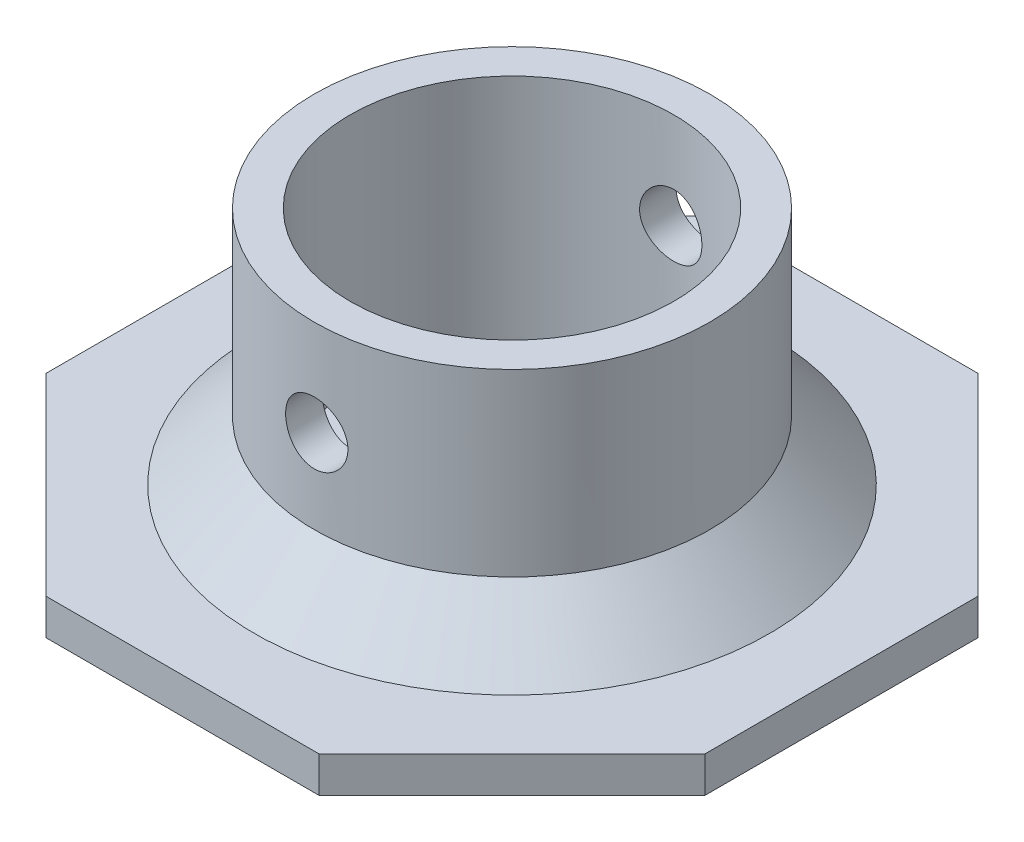
ISO-10303-21;
HEADER;
FILE_DESCRIPTION(('STEP AP214'),'2;1');
FILE_NAME('part.step','',(''),(''),'','','');
FILE_SCHEMA(('AUTOMOTIVE_DESIGN { 1 0 10303 214 1 1 1 1 }'));
ENDSEC;
DATA;
#1=APPLICATION_CONTEXT('core data for automotive mechanical design processes');
#2=APPLICATION_PROTOCOL_DEFINITION('international standard','automotive_design',2000,#1);
#3=PRODUCT_CONTEXT('',#1,'mechanical');
#4=PRODUCT('Part','Part','',(#3));
#5=PRODUCT_RELATED_PRODUCT_CATEGORY('part','',(#4));
#6=PRODUCT_DEFINITION_FORMATION('','',#4);
#7=PRODUCT_DEFINITION_CONTEXT('part definition',#1,'design');
#8=PRODUCT_DEFINITION('design','',#6,#7);
#9=PRODUCT_DEFINITION_SHAPE('','',#8);
#10=(LENGTH_UNIT() NAMED_UNIT(*) SI_UNIT(.MILLI.,.METRE.));
#11=(NAMED_UNIT(*) PLANE_ANGLE_UNIT() SI_UNIT($,.RADIAN.));
#12=(NAMED_UNIT(*) SI_UNIT($,.STERADIAN.) SOLID_ANGLE_UNIT());
#13=UNCERTAINTY_MEASURE_WITH_UNIT(LENGTH_MEASURE(1.E-05),#10,'distance_accuracy_value','');
#14=(GEOMETRIC_REPRESENTATION_CONTEXT(3) GLOBAL_UNCERTAINTY_ASSIGNED_CONTEXT((#13)) GLOBAL_UNIT_ASSIGNED_CONTEXT((#10,
#11,#12)) REPRESENTATION_CONTEXT('',''));
#15=CARTESIAN_POINT('',(0.,0.,0.));
#16=DIRECTION('',(0.,0.,1.));
#17=DIRECTION('',(1.,0.,0.));
#18=AXIS2_PLACEMENT_3D('',#15,#16,#17);
#19=CARTESIAN_POINT('',(11.3908729652601,3.,-27.5));
#20=DIRECTION('',(0.,0.,1.));
#21=DIRECTION('',(1.,0.,0.));
#22=AXIS2_PLACEMENT_3D('',#19,#20,#21);
#23=PLANE('',#22);
#24=DIRECTION('',(-1.,0.,0.));
#25=VECTOR('',#24,1.);
#26=CARTESIAN_POINT('',(11.3908729652601,0.,-27.5));
#27=LINE('',#26,#25);
#28=CARTESIAN_POINT('',(11.3908729652601,0.,-27.5));
#29=VERTEX_POINT('',#28);
#30=CARTESIAN_POINT('',(-11.3908729652601,0.,-27.5));
#31=VERTEX_POINT('',#30);
#32=EDGE_CURVE('E157',#29,#31,#27,.T.);
#33=ORIENTED_EDGE('',*,*,#32,.T.);
#34=DIRECTION('',(0.,-1.,0.));
#35=VECTOR('',#34,1.);
#36=CARTESIAN_POINT('',(-11.3908729652601,3.,-27.5));
#37=LINE('',#36,#35);
#38=CARTESIAN_POINT('',(-11.3908729652601,3.,-27.5));
#39=VERTEX_POINT('',#38);
#40=EDGE_CURVE('E199',#39,#31,#37,.T.);
#41=ORIENTED_EDGE('',*,*,#40,.F.);
#42=DIRECTION('',(-1.,0.,0.));
#43=VECTOR('',#42,1.);
#44=CARTESIAN_POINT('',(11.3908729652601,3.,-27.5));
#45=LINE('',#44,#43);
#46=CARTESIAN_POINT('',(11.3908729652601,3.,-27.5));
#47=VERTEX_POINT('',#46);
#48=EDGE_CURVE('E180',#47,#39,#45,.T.);
#49=ORIENTED_EDGE('',*,*,#48,.F.);
#50=DIRECTION('',(0.,-1.,0.));
#51=VECTOR('',#50,1.);
#52=CARTESIAN_POINT('',(11.3908729652601,3.,-27.5));
#53=LINE('',#52,#51);
#54=EDGE_CURVE('E153',#47,#29,#53,.T.);
#55=ORIENTED_EDGE('',*,*,#54,.T.);
#56=EDGE_LOOP('',(#33,#41,#49,#55));
#57=FACE_BOUND('',#56,.T.);
#58=ADVANCED_FACE('F53',(#57),#23,.F.);
#59=CARTESIAN_POINT('',(-11.3908729652601,3.,-27.5));
#60=DIRECTION('',(0.707106781186548,0.,0.707106781186547));
#61=DIRECTION('',(0.707106781186547,0.,-0.707106781186548));
#62=AXIS2_PLACEMENT_3D('',#59,#60,#61);
#63=PLANE('',#62);
#64=DIRECTION('',(-0.707106781186547,0.,0.707106781186548));
#65=VECTOR('',#64,1.);
#66=CARTESIAN_POINT('',(-11.3908729652601,0.,-27.5));
#67=LINE('',#66,#65);
#68=CARTESIAN_POINT('',(-27.5,0.,-11.3908729652601));
#69=VERTEX_POINT('',#68);
#70=EDGE_CURVE('E161',#31,#69,#67,.T.);
#71=ORIENTED_EDGE('',*,*,#70,.T.);
#72=DIRECTION('',(0.,-1.,0.));
#73=VECTOR('',#72,1.);
#74=CARTESIAN_POINT('',(-27.5,3.,-11.3908729652601));
#75=LINE('',#74,#73);
#76=CARTESIAN_POINT('',(-27.5,3.,-11.3908729652601));
#77=VERTEX_POINT('',#76);
#78=EDGE_CURVE('E195',#77,#69,#75,.T.);
#79=ORIENTED_EDGE('',*,*,#78,.F.);
#80=DIRECTION('',(-0.707106781186547,0.,0.707106781186548));
#81=VECTOR('',#80,1.);
#82=CARTESIAN_POINT('',(-11.3908729652601,3.,-27.5));
#83=LINE('',#82,#81);
#84=EDGE_CURVE('E116',#39,#77,#83,.T.);
#85=ORIENTED_EDGE('',*,*,#84,.F.);
#86=ORIENTED_EDGE('',*,*,#40,.T.);
#87=EDGE_LOOP('',(#71,#79,#85,#86));
#88=FACE_BOUND('',#87,.T.);
#89=ADVANCED_FACE('F277',(#88),#63,.F.);
#90=CARTESIAN_POINT('',(-27.5,3.,-11.3908729652601));
#91=DIRECTION('',(1.,0.,0.));
#92=DIRECTION('',(0.,0.,-1.));
#93=AXIS2_PLACEMENT_3D('',#90,#91,#92);
#94=PLANE('',#93);
#95=DIRECTION('',(0.,0.,1.));
#96=VECTOR('',#95,1.);
#97=CARTESIAN_POINT('',(-27.5,0.,-11.3908729652601));
#98=LINE('',#97,#96);
#99=CARTESIAN_POINT('',(-27.5,0.,11.3908729652601));
#100=VERTEX_POINT('',#99);
#101=EDGE_CURVE('E165',#69,#100,#98,.T.);
#102=ORIENTED_EDGE('',*,*,#101,.T.);
#103=DIRECTION('',(0.,-1.,0.));
#104=VECTOR('',#103,1.);
#105=CARTESIAN_POINT('',(-27.5,3.,11.3908729652601));
#106=LINE('',#105,#104);
#107=CARTESIAN_POINT('',(-27.5,3.,11.3908729652601));
#108=VERTEX_POINT('',#107);
#109=EDGE_CURVE('E191',#108,#100,#106,.T.);
#110=ORIENTED_EDGE('',*,*,#109,.F.);
#111=DIRECTION('',(0.,0.,1.));
#112=VECTOR('',#111,1.);
#113=CARTESIAN_POINT('',(-27.5,3.,-11.3908729652601));
#114=LINE('',#113,#112);
#115=EDGE_CURVE('E291',#77,#108,#114,.T.);
#116=ORIENTED_EDGE('',*,*,#115,.F.);
#117=ORIENTED_EDGE('',*,*,#78,.T.);
#118=EDGE_LOOP('',(#102,#110,#116,#117));
#119=FACE_BOUND('',#118,.T.);
#120=ADVANCED_FACE('F273',(#119),#94,.F.);
#121=CARTESIAN_POINT('',(-27.5,3.,11.3908729652601));
#122=DIRECTION('',(0.707106781186547,0.,-0.707106781186548));
#123=DIRECTION('',(-0.707106781186548,0.,-0.707106781186547));
#124=AXIS2_PLACEMENT_3D('',#121,#122,#123);
#125=PLANE('',#124);
#126=DIRECTION('',(0.707106781186548,0.,0.707106781186547));
#127=VECTOR('',#126,1.);
#128=CARTESIAN_POINT('',(-27.5,0.,11.3908729652601));
#129=LINE('',#128,#127);
#130=CARTESIAN_POINT('',(-11.3908729652601,0.,27.5));
#131=VERTEX_POINT('',#130);
#132=EDGE_CURVE('E168',#100,#131,#129,.T.);
#133=ORIENTED_EDGE('',*,*,#132,.T.);
#134=DIRECTION('',(0.,-1.,0.));
#135=VECTOR('',#134,1.);
#136=CARTESIAN_POINT('',(-11.3908729652601,3.,27.5));
#137=LINE('',#136,#135);
#138=CARTESIAN_POINT('',(-11.3908729652601,3.,27.5));
#139=VERTEX_POINT('',#138);
#140=EDGE_CURVE('E187',#139,#131,#137,.T.);
#141=ORIENTED_EDGE('',*,*,#140,.F.);
#142=DIRECTION('',(0.707106781186548,0.,0.707106781186547));
#143=VECTOR('',#142,1.);
#144=CARTESIAN_POINT('',(-27.5,3.,11.3908729652601));
#145=LINE('',#144,#143);
#146=EDGE_CURVE('E294',#108,#139,#145,.T.);
#147=ORIENTED_EDGE('',*,*,#146,.F.);
#148=ORIENTED_EDGE('',*,*,#109,.T.);
#149=EDGE_LOOP('',(#133,#141,#147,#148));
#150=FACE_BOUND('',#149,.T.);
#151=ADVANCED_FACE('F269',(#150),#125,.F.);
#152=CARTESIAN_POINT('',(-11.3908729652601,3.,27.5));
#153=DIRECTION('',(0.,0.,-1.));
#154=DIRECTION('',(-1.,0.,0.));
#155=AXIS2_PLACEMENT_3D('',#152,#153,#154);
#156=PLANE('',#155);
#157=DIRECTION('',(1.,0.,0.));
#158=VECTOR('',#157,1.);
#159=CARTESIAN_POINT('',(-11.3908729652601,0.,27.5));
#160=LINE('',#159,#158);
#161=CARTESIAN_POINT('',(11.3908729652601,0.,27.5));
#162=VERTEX_POINT('',#161);
#163=EDGE_CURVE('E171',#131,#162,#160,.T.);
#164=ORIENTED_EDGE('',*,*,#163,.T.);
#165=DIRECTION('',(0.,-1.,0.));
#166=VECTOR('',#165,1.);
#167=CARTESIAN_POINT('',(11.3908729652601,3.,27.5));
#168=LINE('',#167,#166);
#169=CARTESIAN_POINT('',(11.3908729652601,3.,27.5));
#170=VERTEX_POINT('',#169);
#171=EDGE_CURVE('E146',#170,#162,#168,.T.);
#172=ORIENTED_EDGE('',*,*,#171,.F.);
#173=DIRECTION('',(1.,0.,0.));
#174=VECTOR('',#173,1.);
#175=CARTESIAN_POINT('',(-11.3908729652601,3.,27.5));
#176=LINE('',#175,#174);
#177=EDGE_CURVE('E135',#139,#170,#176,.T.);
#178=ORIENTED_EDGE('',*,*,#177,.F.);
#179=ORIENTED_EDGE('',*,*,#140,.T.);
#180=EDGE_LOOP('',(#164,#172,#178,#179));
#181=FACE_BOUND('',#180,.T.);
#182=ADVANCED_FACE('F266',(#181),#156,.F.);
#183=CARTESIAN_POINT('',(11.3908729652601,3.,27.5));
#184=DIRECTION('',(-0.707106781186548,0.,-0.707106781186547));
#185=DIRECTION('',(-0.707106781186547,0.,0.707106781186548));
#186=AXIS2_PLACEMENT_3D('',#183,#184,#185);
#187=PLANE('',#186);
#188=DIRECTION('',(0.707106781186547,0.,-0.707106781186548));
#189=VECTOR('',#188,1.);
#190=CARTESIAN_POINT('',(11.3908729652601,0.,27.5));
#191=LINE('',#190,#189);
#192=CARTESIAN_POINT('',(27.5,0.,11.3908729652601));
#193=VERTEX_POINT('',#192);
#194=EDGE_CURVE('E144',#162,#193,#191,.T.);
#195=ORIENTED_EDGE('',*,*,#194,.T.);
#196=DIRECTION('',(0.,-1.,0.));
#197=VECTOR('',#196,1.);
#198=CARTESIAN_POINT('',(27.5,3.,11.3908729652601));
#199=LINE('',#198,#197);
#200=CARTESIAN_POINT('',(27.5,3.,11.3908729652601));
#201=VERTEX_POINT('',#200);
#202=EDGE_CURVE('E141',#201,#193,#199,.T.);
#203=ORIENTED_EDGE('',*,*,#202,.F.);
#204=DIRECTION('',(0.707106781186547,0.,-0.707106781186548));
#205=VECTOR('',#204,1.);
#206=CARTESIAN_POINT('',(11.3908729652601,3.,27.5));
#207=LINE('',#206,#205);
#208=EDGE_CURVE('E129',#170,#201,#207,.T.);
#209=ORIENTED_EDGE('',*,*,#208,.F.);
#210=ORIENTED_EDGE('',*,*,#171,.T.);
#211=EDGE_LOOP('',(#195,#203,#209,#210));
#212=FACE_BOUND('',#211,.T.);
#213=ADVANCED_FACE('F142',(#212),#187,.F.);
#214=CARTESIAN_POINT('',(27.5,3.,11.3908729652601));
#215=DIRECTION('',(-1.,0.,0.));
#216=DIRECTION('',(0.,0.,1.));
#217=AXIS2_PLACEMENT_3D('',#214,#215,#216);
#218=PLANE('',#217);
#219=DIRECTION('',(0.,0.,-1.));
#220=VECTOR('',#219,1.);
#221=CARTESIAN_POINT('',(27.5,0.,11.3908729652601));
#222=LINE('',#221,#220);
#223=CARTESIAN_POINT('',(27.5,0.,-11.3908729652601));
#224=VERTEX_POINT('',#223);
#225=EDGE_CURVE('E101',#193,#224,#222,.T.);
#226=ORIENTED_EDGE('',*,*,#225,.T.);
#227=DIRECTION('',(0.,-1.,0.));
#228=VECTOR('',#227,1.);
#229=CARTESIAN_POINT('',(27.5,3.,-11.3908729652601));
#230=LINE('',#229,#228);
#231=CARTESIAN_POINT('',(27.5,3.,-11.3908729652601));
#232=VERTEX_POINT('',#231);
#233=EDGE_CURVE('E147',#232,#224,#230,.T.);
#234=ORIENTED_EDGE('',*,*,#233,.F.);
#235=DIRECTION('',(0.,0.,-1.));
#236=VECTOR('',#235,1.);
#237=CARTESIAN_POINT('',(27.5,3.,11.3908729652601));
#238=LINE('',#237,#236);
#239=EDGE_CURVE('E133',#201,#232,#238,.T.);
#240=ORIENTED_EDGE('',*,*,#239,.F.);
#241=ORIENTED_EDGE('',*,*,#202,.T.);
#242=EDGE_LOOP('',(#226,#234,#240,#241));
#243=FACE_BOUND('',#242,.T.);
#244=ADVANCED_FACE('F149',(#243),#218,.F.);
#245=CARTESIAN_POINT('',(27.5,3.,-11.3908729652601));
#246=DIRECTION('',(-0.707106781186547,0.,0.707106781186548));
#247=DIRECTION('',(0.707106781186548,0.,0.707106781186547));
#248=AXIS2_PLACEMENT_3D('',#245,#246,#247);
#249=PLANE('',#248);
#250=DIRECTION('',(-0.707106781186548,0.,-0.707106781186547));
#251=VECTOR('',#250,1.);
#252=CARTESIAN_POINT('',(27.5,0.,-11.3908729652601));
#253=LINE('',#252,#251);
#254=EDGE_CURVE('E107',#224,#29,#253,.T.);
#255=ORIENTED_EDGE('',*,*,#254,.T.);
#256=ORIENTED_EDGE('',*,*,#54,.F.);
#257=DIRECTION('',(-0.707106781186548,0.,-0.707106781186547));
#258=VECTOR('',#257,1.);
#259=CARTESIAN_POINT('',(27.5,3.,-11.3908729652601));
#260=LINE('',#259,#258);
#261=EDGE_CURVE('E72',#232,#47,#260,.T.);
#262=ORIENTED_EDGE('',*,*,#261,.F.);
#263=ORIENTED_EDGE('',*,*,#233,.T.);
#264=EDGE_LOOP('',(#255,#256,#262,#263));
#265=FACE_BOUND('',#264,.T.);
#266=ADVANCED_FACE('F254',(#265),#249,.F.);
#267=CARTESIAN_POINT('',(0.,3.,0.));
#268=DIRECTION('',(0.,1.,0.));
#269=DIRECTION('',(0.,0.,1.));
#270=AXIS2_PLACEMENT_3D('',#267,#268,#269);
#271=PLANE('',#270);
#272=CARTESIAN_POINT('',(0.,3.,0.));
#273=DIRECTION('',(0.,1.,0.));
#274=DIRECTION('',(0.,0.,1.));
#275=AXIS2_PLACEMENT_3D('',#272,#273,#274);
#276=CIRCLE('',#275,21.5);
#277=CARTESIAN_POINT('',(0.,3.,-21.5));
#278=VERTEX_POINT('',#277);
#279=EDGE_CURVE('E12',#278,#278,#276,.F.);
#280=ORIENTED_EDGE('',*,*,#279,.T.);
#281=EDGE_LOOP('',(#280));
#282=FACE_BOUND('',#281,.T.);
#283=ORIENTED_EDGE('',*,*,#48,.T.);
#284=ORIENTED_EDGE('',*,*,#84,.T.);
#285=ORIENTED_EDGE('',*,*,#115,.T.);
#286=ORIENTED_EDGE('',*,*,#146,.T.);
#287=ORIENTED_EDGE('',*,*,#177,.T.);
#288=ORIENTED_EDGE('',*,*,#208,.T.);
#289=ORIENTED_EDGE('',*,*,#239,.T.);
#290=ORIENTED_EDGE('',*,*,#261,.T.);
#291=EDGE_LOOP('',(#283,#284,#285,#286,#287,#288,#289,#290));
#292=FACE_BOUND('',#291,.T.);
#293=ADVANCED_FACE('F131',(#282,#292),#271,.T.);
#294=CARTESIAN_POINT('',(0.,0.,0.));
#295=DIRECTION('',(0.,1.,0.));
#296=DIRECTION('',(0.,0.,1.));
#297=AXIS2_PLACEMENT_3D('',#294,#295,#296);
#298=PLANE('',#297);
#299=ORIENTED_EDGE('',*,*,#32,.F.);
#300=ORIENTED_EDGE('',*,*,#254,.F.);
#301=ORIENTED_EDGE('',*,*,#225,.F.);
#302=ORIENTED_EDGE('',*,*,#194,.F.);
#303=ORIENTED_EDGE('',*,*,#163,.F.);
#304=ORIENTED_EDGE('',*,*,#132,.F.);
#305=ORIENTED_EDGE('',*,*,#101,.F.);
#306=ORIENTED_EDGE('',*,*,#70,.F.);
#307=EDGE_LOOP('',(#299,#300,#301,#302,#303,#304,#305,#306));
#308=FACE_BOUND('',#307,.T.);
#309=ADVANCED_FACE('F253',(#308),#298,.F.);
#310=CARTESIAN_POINT('',(0.,23.,0.));
#311=DIRECTION('',(0.,1.,0.));
#312=DIRECTION('',(0.,0.,1.));
#313=AXIS2_PLACEMENT_3D('',#310,#311,#312);
#314=PLANE('',#313);
#315=CARTESIAN_POINT('',(0.,23.,0.));
#316=DIRECTION('',(0.,1.,0.));
#317=DIRECTION('',(0.,0.,1.));
#318=AXIS2_PLACEMENT_3D('',#315,#316,#317);
#319=CIRCLE('',#318,16.5);
#320=CARTESIAN_POINT('',(0.,23.,16.5));
#321=VERTEX_POINT('',#320);
#322=EDGE_CURVE('E162',#321,#321,#319,.T.);
#323=ORIENTED_EDGE('',*,*,#322,.T.);
#324=EDGE_LOOP('',(#323));
#325=FACE_BOUND('',#324,.T.);
#326=CARTESIAN_POINT('',(0.,23.,0.));
#327=DIRECTION('',(0.,1.,0.));
#328=DIRECTION('',(0.,0.,1.));
#329=AXIS2_PLACEMENT_3D('',#326,#327,#328);
#330=CIRCLE('',#329,13.5);
#331=CARTESIAN_POINT('',(0.,23.,13.5));
#332=VERTEX_POINT('',#331);
#333=EDGE_CURVE('E306',#332,#332,#330,.T.);
#334=ORIENTED_EDGE('',*,*,#333,.F.);
#335=EDGE_LOOP('',(#334));
#336=FACE_BOUND('',#335,.T.);
#337=ADVANCED_FACE('F248',(#325,#336),#314,.T.);
#338=CARTESIAN_POINT('',(0.,23.,0.));
#339=DIRECTION('',(0.,-1.,0.));
#340=DIRECTION('',(0.,0.,-1.));
#341=AXIS2_PLACEMENT_3D('',#338,#339,#340);
#342=CYLINDRICAL_SURFACE('',#341,16.5);
#343=CARTESIAN_POINT('',(0.,8.00000000000002,0.));
#344=DIRECTION('',(0.,1.,0.));
#345=DIRECTION('',(0.,0.,1.));
#346=AXIS2_PLACEMENT_3D('',#343,#344,#345);
#347=CIRCLE('',#346,16.5);
#348=CARTESIAN_POINT('',(0.,8.00000000000002,-16.5));
#349=VERTEX_POINT('',#348);
#350=EDGE_CURVE('E64',#349,#349,#347,.T.);
#351=ORIENTED_EDGE('',*,*,#350,.T.);
#352=EDGE_LOOP('',(#351));
#353=FACE_BOUND('',#352,.T.);
#354=CARTESIAN_POINT('',(0.,17.6,-16.5));
#355=CARTESIAN_POINT('',(-0.145079707659088,17.5999940873379,-16.4999975972371));
#356=CARTESIAN_POINT('',(-0.290241390675074,17.5878158460617,-16.4980665349642));
#357=CARTESIAN_POINT('',(-0.57650115009482,17.539440479264,-16.4905490387536));
#358=CARTESIAN_POINT('',(-0.717595234025378,17.5032205410507,-16.4849591330817));
#359=CARTESIAN_POINT('',(-0.991536132240876,17.4078760773327,-16.4707516008059));
#360=CARTESIAN_POINT('',(-1.12438931312134,17.3487694954142,-16.4621363466271));
#361=CARTESIAN_POINT('',(-1.37827333997626,17.2093748247898,-16.4428280149918));
#362=CARTESIAN_POINT('',(-1.49930569652854,17.1290894473782,-16.4321352035489));
#363=CARTESIAN_POINT('',(-1.72717039775433,16.9488822577341,-16.4097565370231));
#364=CARTESIAN_POINT('',(-1.83388653101064,16.8488143541441,-16.3980636851988));
#365=CARTESIAN_POINT('',(-2.02908632053569,16.6321971006489,-16.3750570201548));
#366=CARTESIAN_POINT('',(-2.11756888402617,16.5156467636202,-16.3637432296871));
#367=CARTESIAN_POINT('',(-2.2742481942423,16.2685844335491,-16.3427078647202));
#368=CARTESIAN_POINT('',(-2.3423313954302,16.1379995965535,-16.3329953328843));
#369=CARTESIAN_POINT('',(-2.45555351672993,15.867069073111,-16.316358418715));
#370=CARTESIAN_POINT('',(-2.50069381874197,15.7267239751248,-16.3094338684606));
#371=CARTESIAN_POINT('',(-2.56638551341573,15.4414834180051,-16.2992261305279));
#372=CARTESIAN_POINT('',(-2.58713662359453,15.2966350318303,-16.2959133830614));
#373=CARTESIAN_POINT('',(-2.60407982387838,15.0054771920469,-16.2932147404554));
#374=CARTESIAN_POINT('',(-2.60027346847038,14.8591678315034,-16.293828596762));
#375=CARTESIAN_POINT('',(-2.56837276075107,14.5706585992758,-16.2988867910177));
#376=CARTESIAN_POINT('',(-2.54050168857083,14.4284333325851,-16.3032959141163));
#377=CARTESIAN_POINT('',(-2.46161261650919,14.1507033808741,-16.3153927859671));
#378=CARTESIAN_POINT('',(-2.41059390005683,14.0151989040502,-16.323080636217));
#379=CARTESIAN_POINT('',(-2.28662814128173,13.7540824913007,-16.3409072555691));
#380=CARTESIAN_POINT('',(-2.2135873462146,13.6285158068657,-16.3510564663384));
#381=CARTESIAN_POINT('',(-2.04771746681207,13.3913363291959,-16.3726548345156));
#382=CARTESIAN_POINT('',(-1.95488695157242,13.2797245459025,-16.3841040858956));
#383=CARTESIAN_POINT('',(-1.75085114048477,13.0723297705351,-16.4071677089392));
#384=CARTESIAN_POINT('',(-1.63945404959994,12.9767354139358,-16.4187825067225));
#385=CARTESIAN_POINT('',(-1.40209870207027,12.8055689049118,-16.4407512219597));
#386=CARTESIAN_POINT('',(-1.27614036913857,12.7299968573916,-16.4511051328072));
#387=CARTESIAN_POINT('',(-1.01306840456079,12.6010071908194,-16.4693979491548));
#388=CARTESIAN_POINT('',(-0.875947055130109,12.5476050576861,-16.4773351655401));
#389=CARTESIAN_POINT('',(-0.594529218348129,12.4646399834477,-16.4898864270525));
#390=CARTESIAN_POINT('',(-0.45023326769748,12.4350752620096,-16.4945007203544));
#391=CARTESIAN_POINT('',(-0.160189344225517,12.4008772362872,-16.4998531396363));
#392=CARTESIAN_POINT('',(-0.0144726456462544,12.3959847647168,-16.5006315572156));
#393=CARTESIAN_POINT('',(0.275699431869204,12.4105808642485,-16.4983344957722));
#394=CARTESIAN_POINT('',(0.420154853855693,12.4300685998959,-16.4952591488092));
#395=CARTESIAN_POINT('',(0.702911945399546,12.4926563885616,-16.485625032623));
#396=CARTESIAN_POINT('',(0.841242458036632,12.5356292725411,-16.4790850298555));
#397=CARTESIAN_POINT('',(1.10873542651302,12.6438327647357,-16.4632522620778));
#398=CARTESIAN_POINT('',(1.2378974134152,12.709064510422,-16.4539593563919));
#399=CARTESIAN_POINT('',(1.48452039240528,12.8605356640011,-16.4335525983705));
#400=CARTESIAN_POINT('',(1.60187991971414,12.9469383642653,-16.4224248229748));
#401=CARTESIAN_POINT('',(1.82052583077625,13.1380726345572,-16.3996278076964));
#402=CARTESIAN_POINT('',(1.92181117715336,13.2428053866313,-16.3879585329298));
#403=CARTESIAN_POINT('',(2.10638445671494,13.4687844076345,-16.3652648365844));
#404=CARTESIAN_POINT('',(2.18949804207133,13.5901738823497,-16.3542473439486));
#405=CARTESIAN_POINT('',(2.33415409382389,13.8453434498337,-16.3342303106362));
#406=CARTESIAN_POINT('',(2.3956971892386,13.9791231811456,-16.3252307111185));
#407=CARTESIAN_POINT('',(2.49519922443313,14.254770197277,-16.3103194171144));
#408=CARTESIAN_POINT('',(2.53324771392533,14.3966044950133,-16.3043960116169));
#409=CARTESIAN_POINT('',(2.58496413077363,14.6847511160429,-16.2962774103163));
#410=CARTESIAN_POINT('',(2.59863393271327,14.8310630941476,-16.2940819278575));
#411=CARTESIAN_POINT('',(2.60115693365841,15.1222726755629,-16.293679195034));
#412=CARTESIAN_POINT('',(2.59028438852455,15.2671679156844,-16.2954278693291));
#413=CARTESIAN_POINT('',(2.5446213921349,15.5530409746344,-16.3026202726238));
#414=CARTESIAN_POINT('',(2.50983099571011,15.6940188024428,-16.3080639931527));
#415=CARTESIAN_POINT('',(2.41742046479762,15.9679658721493,-16.3220171142952));
#416=CARTESIAN_POINT('',(2.3598214717865,16.1009423994029,-16.3305236752761));
#417=CARTESIAN_POINT('',(2.22345641333869,16.3553889764404,-16.3496471298824));
#418=CARTESIAN_POINT('',(2.14468948263941,16.4768585555907,-16.360264109769));
#419=CARTESIAN_POINT('',(1.96723576880604,16.7062331916925,-16.3825529826131));
#420=CARTESIAN_POINT('',(1.86834644018296,16.8139805994122,-16.3942348758782));
#421=CARTESIAN_POINT('',(1.6538829489449,17.0114474982744,-16.4172554913582));
#422=CARTESIAN_POINT('',(1.53830492722085,17.1011628081484,-16.4285941334638));
#423=CARTESIAN_POINT('',(1.2929094966485,17.2605141340754,-16.4497304176582));
#424=CARTESIAN_POINT('',(1.16300936477322,17.3300240583658,-16.4595182163399));
#425=CARTESIAN_POINT('',(0.893280564047893,17.4461325341761,-16.4763538972819));
#426=CARTESIAN_POINT('',(0.753462171386212,17.492754414099,-16.4834045677912));
#427=CARTESIAN_POINT('',(0.510877325671568,17.551387929454,-16.4923933047394));
#428=CARTESIAN_POINT('',(0.409595533812697,17.5695890112142,-16.4952309032671));
#429=CARTESIAN_POINT('',(0.205556199459395,17.5938970539422,-16.4990350886503));
#430=CARTESIAN_POINT('',(0.102798678292409,17.6000041895166,-16.5000017025183));
#431=CARTESIAN_POINT('',(0.,17.6,-16.5));
#432=B_SPLINE_CURVE_WITH_KNOTS('',3,(#354,#355,#356,#357,#358,#359,#360,#361,#362,#363,#364,
#365,#366,#367,#368,#369,#370,#371,#372,#373,#374,#375,#376,#377,#378,#379,#380,#381,#382,#383,
#384,#385,#386,#387,#388,#389,#390,#391,#392,#393,#394,#395,#396,#397,#398,#399,#400,#401,#402,
#403,#404,#405,#406,#407,#408,#409,#410,#411,#412,#413,#414,#415,#416,#417,#418,#419,#420,#421,
#422,#423,#424,#425,#426,#427,#428,#429,#430,#431),.UNSPECIFIED.,.T.,.F.,(4,2,2,2,2,2,2,2,2,2,2,
2,2,2,2,2,2,2,2,2,2,2,2,2,2,2,2,2,2,2,2,2,2,2,2,2,2,2,4),(0.,0.434863432449835,
0.870140089230455,1.30507616915234,1.73995659586559,2.17817735234873,2.61642436473993,
3.05706724061288,3.49768357247067,3.93466608767687,4.37162094217257,4.80456463095428,
5.23752172308889,5.67234867622513,6.10720708038181,6.54687302896644,6.98654128108057,
7.42651613145371,7.86645811859784,8.30176900741369,8.73706497951573,9.17002690374833,
9.60301095649423,10.0394459980189,10.4759091942193,10.9163922211637,11.3568624020833,
11.7956431968322,12.2343902503583,12.6682586949802,13.1021261449743,13.5355923774681,
13.9690763310639,14.4071610415383,14.8453472178504,15.2862119122188,15.7266263220342,
16.0347606037671,16.3428904367731),.UNSPECIFIED.);
#433=CARTESIAN_POINT('',(0.,17.6,-16.5));
#434=VERTEX_POINT('',#433);
#435=EDGE_CURVE('E239',#434,#434,#432,.T.);
#436=ORIENTED_EDGE('',*,*,#435,.T.);
#437=EDGE_LOOP('',(#436));
#438=FACE_BOUND('',#437,.T.);
#439=CARTESIAN_POINT('',(2.6,15.,16.2938638757049));
#440=CARTESIAN_POINT('',(2.59999407667064,14.854932897538,16.293866392648));
#441=CARTESIAN_POINT('',(2.58781788007555,14.7097837869101,16.2958221896259));
#442=CARTESIAN_POINT('',(2.53945137169102,14.4235501425727,16.3034279547514));
#443=CARTESIAN_POINT('',(2.50323820130888,14.2824696113716,16.3090814392374));
#444=CARTESIAN_POINT('',(2.40791352938946,14.0085573926926,16.3234267190648));
#445=CARTESIAN_POINT('',(2.3488202911704,13.8757192238765,16.3321160905629));
#446=CARTESIAN_POINT('',(2.20945705994042,13.621860429865,16.3515512005926));
#447=CARTESIAN_POINT('',(2.12918974637429,13.5008383120763,16.3622966788896));
#448=CARTESIAN_POINT('',(1.94900094122266,13.2729623764889,16.3847392305872));
#449=CARTESIAN_POINT('',(1.8489293108947,13.1662279364977,16.3964431458701));
#450=CARTESIAN_POINT('',(1.63229687414352,12.9709927210125,16.4194228987639));
#451=CARTESIAN_POINT('',(1.51573513098847,12.882492982055,16.4306987120101));
#452=CARTESIAN_POINT('',(1.26866248295749,12.7257954492902,16.4516237440736));
#453=CARTESIAN_POINT('',(1.13808069660685,12.6577081179649,16.4612639942734));
#454=CARTESIAN_POINT('',(0.867156791728019,12.5444775238342,16.4777557637965));
#455=CARTESIAN_POINT('',(0.726815241836789,12.4993329255785,16.4846074454321));
#456=CARTESIAN_POINT('',(0.441586875296968,12.4336326389317,16.4947017961297));
#457=CARTESIAN_POINT('',(0.296747234958106,12.4128767274525,16.4979738373093));
#458=CARTESIAN_POINT('',(0.00560661766932689,12.3959208927409,16.5006410146622));
#459=CARTESIAN_POINT('',(-0.140694269497524,12.3997194699673,16.5000363875833));
#460=CARTESIAN_POINT('',(-0.429237096763985,12.4316075998386,16.495041725683));
#461=CARTESIAN_POINT('',(-0.571503509939689,12.459481713197,16.4906852650461));
#462=CARTESIAN_POINT('',(-0.849314173687603,12.5383910283259,16.4787138364403));
#463=CARTESIAN_POINT('',(-0.984858236813081,12.5894268755384,16.4710987776652));
#464=CARTESIAN_POINT('',(-1.24602365254079,12.7134286342256,16.4534083020588));
#465=CARTESIAN_POINT('',(-1.37160163864502,12.786484389975,16.4433228378292));
#466=CARTESIAN_POINT('',(-1.60879742863005,12.952386487333,16.4218140310459));
#467=CARTESIAN_POINT('',(-1.72041421916963,13.0452342641788,16.4103905914947));
#468=CARTESIAN_POINT('',(-1.92779048747054,13.249282657324,16.3873319540661));
#469=CARTESIAN_POINT('',(-2.02336478377184,13.3606714625502,16.3756958033865));
#470=CARTESIAN_POINT('',(-2.19449471842671,13.5980029679465,16.3536436527602));
#471=CARTESIAN_POINT('',(-2.27005020802756,13.7239457762525,16.3432276618805));
#472=CARTESIAN_POINT('',(-2.3990278158039,13.9870128476475,16.3247950889778));
#473=CARTESIAN_POINT('',(-2.4524294607291,14.1241473139854,16.3167807282872));
#474=CARTESIAN_POINT('',(-2.53538957138001,14.4055937620372,16.3040969628986));
#475=CARTESIAN_POINT('',(-2.56494990128578,14.5499051816398,16.2994272966782));
#476=CARTESIAN_POINT('',(-2.59913130805865,14.8399573727718,16.2940116934415));
#477=CARTESIAN_POINT('',(-2.60401554124238,14.9856663854884,16.2932243558147));
#478=CARTESIAN_POINT('',(-2.58940570824446,15.2758211390012,16.2955524818916));
#479=CARTESIAN_POINT('',(-2.56991247987893,15.4202669230408,16.2986678114665));
#480=CARTESIAN_POINT('',(-2.50732478144789,15.702970549146,16.3084121249371));
#481=CARTESIAN_POINT('',(-2.46436267249619,15.8412584337854,16.3150213968168));
#482=CARTESIAN_POINT('',(-2.356194934217,16.1086708881834,16.3309925158333));
#483=CARTESIAN_POINT('',(-2.29098810270257,16.2377949622402,16.3403545117336));
#484=CARTESIAN_POINT('',(-2.13955458578132,16.4843903570674,16.360873164321));
#485=CARTESIAN_POINT('',(-2.05315830721463,16.6017563271897,16.3720440405384));
#486=CARTESIAN_POINT('',(-1.86203280485629,16.8204182090184,16.3948795038577));
#487=CARTESIAN_POINT('',(-1.75730243324056,16.9217131138225,16.4065441218362));
#488=CARTESIAN_POINT('',(-1.53131962913678,17.106309563172,16.4291828468114));
#489=CARTESIAN_POINT('',(-1.40992348921564,17.1894362208833,16.4401495785078));
#490=CARTESIAN_POINT('',(-1.15473686365681,17.3341151797897,16.4600406531983));
#491=CARTESIAN_POINT('',(-1.02094674527795,17.3956681199997,16.4689650566837));
#492=CARTESIAN_POINT('',(-0.745304260435735,17.4951761571555,16.4837337375662));
#493=CARTESIAN_POINT('',(-0.603486440068198,17.533225056358,16.489590244208));
#494=CARTESIAN_POINT('',(-0.31537477369982,17.5849478667015,16.4976147612669));
#495=CARTESIAN_POINT('',(-0.169081256128323,17.5986235620198,16.4997830416705));
#496=CARTESIAN_POINT('',(0.122136530999053,17.6011647663149,16.5001836038774));
#497=CARTESIAN_POINT('',(0.267058483236016,17.5902971975266,16.4984582315658));
#498=CARTESIAN_POINT('',(0.552986263198058,17.5446347994771,16.491351204299));
#499=CARTESIAN_POINT('',(0.693992107409682,17.5098400709633,16.4859695647388));
#500=CARTESIAN_POINT('',(0.967999024686,17.4174092112919,16.4721521272155));
#501=CARTESIAN_POINT('',(1.10100711011712,17.3597934359846,16.4637190516412));
#502=CARTESIAN_POINT('',(1.35550987304168,17.223384971155,16.4447224842444));
#503=CARTESIAN_POINT('',(1.4770040994822,17.1445914524627,16.4341589090106));
#504=CARTESIAN_POINT('',(1.70638023957295,16.9671072667295,16.4119377536817));
#505=CARTESIAN_POINT('',(1.81410922412607,16.8682202077144,16.4002700351128));
#506=CARTESIAN_POINT('',(2.01154000642791,16.6537689979789,16.3772284658127));
#507=CARTESIAN_POINT('',(2.10123757320228,16.5382009440572,16.3658546845967));
#508=CARTESIAN_POINT('',(2.26056832745029,16.2928148074304,16.3446122914277));
#509=CARTESIAN_POINT('',(2.33007260273943,16.1629121727943,16.3347535315375));
#510=CARTESIAN_POINT('',(2.44616983828549,15.8931783438697,16.3177732937876));
#511=CARTESIAN_POINT('',(2.49278618413714,15.7533574514251,16.3106490236123));
#512=CARTESIAN_POINT('',(2.55140519433029,15.510787153103,16.3015613450866));
#513=CARTESIAN_POINT('',(2.56959977121314,15.4095234059164,16.2986904252759));
#514=CARTESIAN_POINT('',(2.59389918093357,15.2055201463558,16.2948408132685));
#515=CARTESIAN_POINT('',(2.60000419670393,15.1027806563357,16.29386209244));
#516=CARTESIAN_POINT('',(2.6,15.,16.2938638757049));
#517=B_SPLINE_CURVE_WITH_KNOTS('',3,(#439,#440,#441,#442,#443,#444,#445,#446,#447,#448,#449,
#450,#451,#452,#453,#454,#455,#456,#457,#458,#459,#460,#461,#462,#463,#464,#465,#466,#467,#468,
#469,#470,#471,#472,#473,#474,#475,#476,#477,#478,#479,#480,#481,#482,#483,#484,#485,#486,#487,
#488,#489,#490,#491,#492,#493,#494,#495,#496,#497,#498,#499,#500,#501,#502,#503,#504,#505,#506,
#507,#508,#509,#510,#511,#512,#513,#514,#515,#516),.UNSPECIFIED.,.T.,.F.,(4,2,2,2,2,2,2,2,2,2,2,
2,2,2,2,2,2,2,2,2,2,2,2,2,2,2,2,2,2,2,2,2,2,2,2,2,2,2,4),(0.,0.434825556497144,
0.870065215371208,1.30495817128628,1.73979612063687,2.17806645698486,2.61636169957531,
3.05698766969635,3.49758798892608,3.93454527580499,4.3714758779821,4.80453665519293,
5.23760950113569,5.67247382981447,6.10736970382561,6.54698395560366,6.9866014739096,
7.42662436009594,7.86661283704649,8.30189903653911,8.73717027632112,9.17001162008877,
9.60287635990756,10.0393256375652,10.4758022493413,10.9163114627039,11.3568076270544,
11.7955342619442,12.2342287796664,12.6681752435833,13.1021198803384,13.5356783169539,
13.9692537311122,14.4072904772952,14.8454298867586,15.2863077916717,15.7267342901103,
16.0348146997655,16.342890447677),.UNSPECIFIED.);
#518=CARTESIAN_POINT('',(2.6,15.,16.2938638757049));
#519=VERTEX_POINT('',#518);
#520=EDGE_CURVE('E232',#519,#519,#517,.T.);
#521=ORIENTED_EDGE('',*,*,#520,.T.);
#522=EDGE_LOOP('',(#521));
#523=FACE_BOUND('',#522,.T.);
#524=ORIENTED_EDGE('',*,*,#322,.F.);
#525=EDGE_LOOP('',(#524));
#526=FACE_BOUND('',#525,.T.);
#527=ADVANCED_FACE('F244',(#353,#438,#523,#526),#342,.T.);
#528=CARTESIAN_POINT('',(0.,23.,0.));
#529=DIRECTION('',(0.,-1.,0.));
#530=DIRECTION('',(0.,0.,-1.));
#531=AXIS2_PLACEMENT_3D('',#528,#529,#530);
#532=CYLINDRICAL_SURFACE('',#531,13.5);
#533=CARTESIAN_POINT('',(0.,17.6,-13.5));
#534=CARTESIAN_POINT('',(-0.144610590203913,17.5999945538972,-13.4999973584885));
#535=CARTESIAN_POINT('',(-0.289291224138813,17.587894488529,-13.4976524858873));
#536=CARTESIAN_POINT('',(-0.574570469188042,17.5398479991355,-13.4885244025952));
#537=CARTESIAN_POINT('',(-0.715165616282774,17.5038819218042,-13.4817375340498));
#538=CARTESIAN_POINT('',(-0.988107316329236,17.4092495991809,-13.4644841179684));
#539=CARTESIAN_POINT('',(-1.12046136872645,17.3506043532281,-13.4540209752249));
#540=CARTESIAN_POINT('',(-1.373440502824,17.2123391544589,-13.4305555223216));
#541=CARTESIAN_POINT('',(-1.49406643221353,17.132720719095,-13.41755339588));
#542=CARTESIAN_POINT('',(-1.72169649380931,16.953704542206,-13.3902602206141));
#543=CARTESIAN_POINT('',(-1.82853146273684,16.8540936433225,-13.3759562772996));
#544=CARTESIAN_POINT('',(-2.0240829844995,16.6383785356999,-13.347766553487));
#545=CARTESIAN_POINT('',(-2.11279819132129,16.5222731027618,-13.3338808041195));
#546=CARTESIAN_POINT('',(-2.27030206835222,16.2756606963951,-13.3079741039925));
#547=CARTESIAN_POINT('',(-2.33891742413479,16.1450411332829,-13.2959697651668));
#548=CARTESIAN_POINT('',(-2.45316404358777,15.8738583708148,-13.2753673339487));
#549=CARTESIAN_POINT('',(-2.49879740404962,15.7332960799313,-13.2667689308267));
#550=CARTESIAN_POINT('',(-2.56523924900593,15.4480319897217,-13.2540819730487));
#551=CARTESIAN_POINT('',(-2.58634346792959,15.303401506147,-13.2499397391403));
#552=CARTESIAN_POINT('',(-2.60404615684068,15.0125977720644,-13.2464723880244));
#553=CARTESIAN_POINT('',(-2.60064694716751,14.866424668943,-13.2471468147056));
#554=CARTESIAN_POINT('',(-2.56967879290572,14.5788359839136,-13.2531877509929));
#555=CARTESIAN_POINT('',(-2.54244722251721,14.437382493028,-13.2584887631528));
#556=CARTESIAN_POINT('',(-2.46511915207017,14.1610901243068,-13.2730826007927));
#557=CARTESIAN_POINT('',(-2.41502163206945,14.0262515418282,-13.2823756043357));
#558=CARTESIAN_POINT('',(-2.29305693400073,13.7660353756649,-13.3039742037509));
#559=CARTESIAN_POINT('',(-2.2210545324641,13.6407227812746,-13.3162984187442));
#560=CARTESIAN_POINT('',(-2.05741949905652,13.4038314041999,-13.3425586454419));
#561=CARTESIAN_POINT('',(-1.96578476914043,13.29225409137,-13.356494829339));
#562=CARTESIAN_POINT('',(-1.76367232845538,13.0840522945268,-13.3846934725822));
#563=CARTESIAN_POINT('',(-1.65290629746995,12.9877076924256,-13.3989575010973));
#564=CARTESIAN_POINT('',(-1.41663760363385,12.8149240560146,-13.4259917112522));
#565=CARTESIAN_POINT('',(-1.29113477720006,12.7384852426958,-13.4387618763066));
#566=CARTESIAN_POINT('',(-1.02865553377425,12.6076375624991,-13.4613974705556));
#567=CARTESIAN_POINT('',(-0.891663664473741,12.5532589582656,-13.4712589044695));
#568=CARTESIAN_POINT('',(-0.610257245595778,12.4683644407564,-13.4869352781576));
#569=CARTESIAN_POINT('',(-0.465843530622821,12.4378458505948,-13.4927506718542));
#570=CARTESIAN_POINT('',(-0.176099599229247,12.4019299098026,-13.4996170309105));
#571=CARTESIAN_POINT('',(-0.0308185630689951,12.3961492628486,-13.5007406846376));
#572=CARTESIAN_POINT('',(0.258633879703286,12.4088435011883,-13.4982981905097));
#573=CARTESIAN_POINT('',(0.402805343573463,12.4273171263124,-13.4947322863081));
#574=CARTESIAN_POINT('',(0.684722067011258,12.4876769245182,-13.483356698004));
#575=CARTESIAN_POINT('',(0.822510636871235,12.5293680604089,-13.4755823814103));
#576=CARTESIAN_POINT('',(1.08914191148907,12.6347675354845,-13.4566582335177));
#577=CARTESIAN_POINT('',(1.21798398240383,12.6984774327509,-13.4455081633524));
#578=CARTESIAN_POINT('',(1.46469300718168,12.8469466197442,-13.420888070401));
#579=CARTESIAN_POINT('',(1.58241728438912,12.9319387413523,-13.4073929281635));
#580=CARTESIAN_POINT('',(1.80207010864301,13.1202460290325,-13.3796420906154));
#581=CARTESIAN_POINT('',(1.90399709181229,13.2235630070336,-13.3653863201927));
#582=CARTESIAN_POINT('',(2.09062762995688,13.4473263947817,-13.3374782394589));
#583=CARTESIAN_POINT('',(2.17506897419849,13.5679931494876,-13.3238372269319));
#584=CARTESIAN_POINT('',(2.32248445661941,13.8220234909558,-13.2989352273926));
#585=CARTESIAN_POINT('',(2.3854594185887,13.9553865902341,-13.2876741490548));
#586=CARTESIAN_POINT('',(2.48778823791799,14.230375869757,-13.2688967357344));
#587=CARTESIAN_POINT('',(2.52725957944056,14.3719570024522,-13.261361808009));
#588=CARTESIAN_POINT('',(2.58182072128271,14.659901229978,-13.2508485589497));
#589=CARTESIAN_POINT('',(2.5969134423256,14.8062637498223,-13.2478696917714));
#590=CARTESIAN_POINT('',(2.60218701489192,15.0969871550068,-13.2468345819844));
#591=CARTESIAN_POINT('',(2.59278175847019,15.2413404023383,-13.2486965526752));
#592=CARTESIAN_POINT('',(2.55023543651599,15.5263666590416,-13.2569514149166));
#593=CARTESIAN_POINT('',(2.51709453172967,15.6670396933304,-13.2633442757823));
#594=CARTESIAN_POINT('',(2.42819633487836,15.9404733921309,-13.2799053053674));
#595=CARTESIAN_POINT('',(2.37248624121672,16.0732499099297,-13.2900655916268));
#596=CARTESIAN_POINT('',(2.24007720795454,16.3276370986618,-13.3130217940401));
#597=CARTESIAN_POINT('',(2.16337667354827,16.4492469202369,-13.3258179104401));
#598=CARTESIAN_POINT('',(1.98973518546962,16.6799170235066,-13.3528564026399));
#599=CARTESIAN_POINT('',(1.89249393067965,16.7887489857285,-13.3671184144456));
#600=CARTESIAN_POINT('',(1.6811550960181,16.9886883247492,-13.3953372393878));
#601=CARTESIAN_POINT('',(1.56705364960602,17.0797916247081,-13.4092939816718));
#602=CARTESIAN_POINT('',(1.32392211064709,17.2425065098426,-13.4354868934172));
#603=CARTESIAN_POINT('',(1.19475948009414,17.3139230142638,-13.4477052999217));
#604=CARTESIAN_POINT('',(0.926071910355114,17.4339264222412,-13.468870900475));
#605=CARTESIAN_POINT('',(0.786556686492742,17.4825344241924,-13.4778211159694));
#606=CARTESIAN_POINT('',(0.538891060032945,17.5458531006957,-13.4896514230728));
#607=CARTESIAN_POINT('',(0.432173765786125,17.5661228906022,-13.4935099071809));
#608=CARTESIAN_POINT('',(0.216984094571444,17.5931981957792,-13.4986851512552));
#609=CARTESIAN_POINT('',(0.108511766642595,17.6000040866042,-13.5000019821168));
#610=CARTESIAN_POINT('',(0.,17.6,-13.5));
#611=B_SPLINE_CURVE_WITH_KNOTS('',3,(#533,#534,#535,#536,#537,#538,#539,#540,#541,#542,#543,
#544,#545,#546,#547,#548,#549,#550,#551,#552,#553,#554,#555,#556,#557,#558,#559,#560,#561,#562,
#563,#564,#565,#566,#567,#568,#569,#570,#571,#572,#573,#574,#575,#576,#577,#578,#579,#580,#581,
#582,#583,#584,#585,#586,#587,#588,#589,#590,#591,#592,#593,#594,#595,#596,#597,#598,#599,#600,
#601,#602,#603,#604,#605,#606,#607,#608,#609,#610),.UNSPECIFIED.,.T.,.F.,(4,2,2,2,2,2,2,2,2,2,2,
2,2,2,2,2,2,2,2,2,2,2,2,2,2,2,2,2,2,2,2,2,2,2,2,2,2,2,4),(0.,0.433434882926091,
0.867227136710452,1.30061868693004,1.73397888900717,2.17223166713135,2.61051698871337,
3.05247718961873,3.49439706041711,3.93093178921298,4.36742518112333,4.79783767693442,
5.22826937329393,5.66141407205366,6.09460508273379,6.53500838891494,6.97541658417547,
7.41642691382443,7.85738775884815,8.29149092354156,8.72557153460137,9.15605951800135,
9.5865779696349,10.0220295685946,10.457524248251,10.8991398161626,11.3407384348066,
11.780110753595,12.2194304287078,12.6513761502337,13.0833189464991,13.5143630561662,
13.9454399246767,14.3833193404845,14.8212993312885,15.2634749434186,15.705240722552,
16.0304872813663,16.3557247678085),.UNSPECIFIED.);
#612=CARTESIAN_POINT('',(0.,17.6,-13.5));
#613=VERTEX_POINT('',#612);
#614=EDGE_CURVE('E215',#613,#613,#611,.T.);
#615=ORIENTED_EDGE('',*,*,#614,.F.);
#616=EDGE_LOOP('',(#615));
#617=FACE_BOUND('',#616,.T.);
#618=CARTESIAN_POINT('',(2.6,15.,13.2472638684371));
#619=CARTESIAN_POINT('',(2.5999945318734,14.8554174469704,13.2472667014917));
#620=CARTESIAN_POINT('',(2.58789899928568,14.7107647896969,13.2496565771073));
#621=CARTESIAN_POINT('',(2.53987214562804,14.4255436386008,13.2589451032487));
#622=CARTESIAN_POINT('',(2.50392106402563,14.2849786315908,13.2658474916044));
#623=CARTESIAN_POINT('',(2.40933258412985,14.0121007550054,13.2833509637032));
#624=CARTESIAN_POINT('',(2.35071689033713,13.8797801306344,13.2939485078727));
#625=CARTESIAN_POINT('',(2.21252134852888,13.6268573256035,13.3176440183419));
#626=CARTESIAN_POINT('',(2.13294294937454,13.5062543358543,13.3307418118169));
#627=CARTESIAN_POINT('',(1.95396777097845,13.2785996961242,13.3581540318469));
#628=CARTESIAN_POINT('',(1.85434884651678,13.1717241680599,13.3724809589961));
#629=CARTESIAN_POINT('',(1.63860048629743,12.9760939880197,13.4006269100122));
#630=CARTESIAN_POINT('',(1.52246993855242,12.8873405574712,13.4144458995927));
#631=CARTESIAN_POINT('',(1.27583421646644,12.7297956327684,13.4401532308632));
#632=CARTESIAN_POINT('',(1.14522077097526,12.6611707221412,13.4520251213919));
#633=CARTESIAN_POINT('',(0.874051248366249,12.5469047675219,13.4723604894405));
#634=CARTESIAN_POINT('',(0.733496035058808,12.5012617294948,13.4808242626548));
#635=CARTESIAN_POINT('',(0.448259014240451,12.434801238874,13.4933014563209));
#636=CARTESIAN_POINT('',(0.303648799687022,12.4136866784216,13.4973680955336));
#637=CARTESIAN_POINT('',(0.0128851521888617,12.3959562762501,13.5007764010612));
#638=CARTESIAN_POINT('',(-0.133268141251371,12.3993382385043,13.5001184909153));
#639=CARTESIAN_POINT('',(-0.420930035161298,12.4302780252944,13.4941932748738));
#640=CARTESIAN_POINT('',(-0.562474487877007,12.4575158903024,13.4889869750901));
#641=CARTESIAN_POINT('',(-0.83894548350262,12.534887673879,13.4746185343223));
#642=CARTESIAN_POINT('',(-0.97387177535932,12.5850224602763,13.4654562434007));
#643=CARTESIAN_POINT('',(-1.23419833645566,12.7070664190359,13.4441039013973));
#644=CARTESIAN_POINT('',(-1.35953762269563,12.779102472596,13.4318962837599));
#645=CARTESIAN_POINT('',(-1.59646833310591,12.9428104794026,13.4058016204836));
#646=CARTESIAN_POINT('',(-1.70805828334857,13.0344845349615,13.3919143951065));
#647=CARTESIAN_POINT('',(-1.91621967567755,13.2366262715952,13.3637319769855));
#648=CARTESIAN_POINT('',(-2.01251904194832,13.347373917519,13.3494338185956));
#649=CARTESIAN_POINT('',(-2.18521997544906,13.5835892397859,13.3222550509711));
#650=CARTESIAN_POINT('',(-2.26162121887891,13.7090571556224,13.3093744648066));
#651=CARTESIAN_POINT('',(-2.39244120553065,13.9715241646256,13.2864842926664));
#652=CARTESIAN_POINT('',(-2.44681861017819,14.1085443645266,13.2764801158011));
#653=CARTESIAN_POINT('',(-2.53170218280698,14.3900127576892,13.2605568468884));
#654=CARTESIAN_POINT('',(-2.56221121698975,14.5344600568566,13.2546372643579));
#655=CARTESIAN_POINT('',(-2.59809101545643,14.8242238843946,13.2476509543176));
#656=CARTESIAN_POINT('',(-2.60385347334136,14.969490140255,13.2465086192817));
#657=CARTESIAN_POINT('',(-2.59112813771592,15.2589087673216,13.2490035691185));
#658=CARTESIAN_POINT('',(-2.57264161341646,15.4030611964292,13.2526406038352));
#659=CARTESIAN_POINT('',(-2.51227991111692,15.6848609672736,13.2642139122766));
#660=CARTESIAN_POINT('',(-2.47061165008486,15.8225543345677,13.2721121326441));
#661=CARTESIAN_POINT('',(-2.3652895088209,16.0890052334105,13.2912848640639));
#662=CARTESIAN_POINT('',(-2.30163393108807,16.2177620741047,13.3025596357895));
#663=CARTESIAN_POINT('',(-2.15324854345801,16.4644059230183,13.3273863358204));
#664=CARTESIAN_POINT('',(-2.06827223373125,16.5821419665389,13.3409642512577));
#665=CARTESIAN_POINT('',(-1.87998841236596,16.8018258038733,13.3687949740708));
#666=CARTESIAN_POINT('',(-1.77667915747209,16.9037720945325,13.3830478455326));
#667=CARTESIAN_POINT('',(-1.55290899624565,17.0904545917409,13.4108664735228));
#668=CARTESIAN_POINT('',(-1.43222603523535,17.1749268020106,13.4244196502838));
#669=CARTESIAN_POINT('',(-1.17815405932704,17.3223963754091,13.4490973463794));
#670=CARTESIAN_POINT('',(-1.04476555230008,17.3853945964441,13.4602219627308));
#671=CARTESIAN_POINT('',(-0.769784113016971,17.4877368589934,13.4787351489617));
#672=CARTESIAN_POINT('',(-0.628240026306306,17.527208347429,13.4861438132682));
#673=CARTESIAN_POINT('',(-0.340374756798342,17.5817822968306,13.4964762486779));
#674=CARTESIAN_POINT('',(-0.19405410748484,17.596887469781,13.4994005188949));
#675=CARTESIAN_POINT('',(0.0966831327370768,17.6022013345618,13.5004240043982));
#676=CARTESIAN_POINT('',(0.24109232750474,17.5928080174218,13.4986003530443));
#677=CARTESIAN_POINT('',(0.526233659933037,17.5502660466975,13.4904939413134));
#678=CARTESIAN_POINT('',(0.666965837094009,17.5171176484108,13.4842112288583));
#679=CARTESIAN_POINT('',(0.940532820248146,17.4281779073322,13.4678934769194));
#680=CARTESIAN_POINT('',(1.07338258000637,17.3724311202773,13.4578658241302));
#681=CARTESIAN_POINT('',(1.32790122636285,17.2399257698471,13.4351413727341));
#682=CARTESIAN_POINT('',(1.44956930840157,17.1631656960732,13.4224443822751));
#683=CARTESIAN_POINT('',(1.68024803858719,16.9894537209378,13.3955392659764));
#684=CARTESIAN_POINT('',(1.78904070336098,16.8922153946706,13.3813112782321));
#685=CARTESIAN_POINT('',(1.98890211503314,16.6808992216942,13.3530701074238));
#686=CARTESIAN_POINT('',(2.0799666772277,16.566817410242,13.3390569757939));
#687=CARTESIAN_POINT('',(2.24263368579727,16.323706456897,13.3126808128347));
#688=CARTESIAN_POINT('',(2.31403556542327,16.194541134619,13.3003353972643));
#689=CARTESIAN_POINT('',(2.43401091428587,15.9258490854872,13.2789056484355));
#690=CARTESIAN_POINT('',(2.4826055974271,15.7863321275874,13.2698182865937));
#691=CARTESIAN_POINT('',(2.54589157568953,15.5387008153969,13.2577961652869));
#692=CARTESIAN_POINT('',(2.56614685235048,15.4320217019763,13.2538704153641));
#693=CARTESIAN_POINT('',(2.59320291401862,15.2169081773746,13.2486032429307));
#694=CARTESIAN_POINT('',(2.60000410249067,15.1084738189286,13.2472617429231));
#695=CARTESIAN_POINT('',(2.6,15.,13.2472638684371));
#696=B_SPLINE_CURVE_WITH_KNOTS('',3,(#618,#619,#620,#621,#622,#623,#624,#625,#626,#627,#628,
#629,#630,#631,#632,#633,#634,#635,#636,#637,#638,#639,#640,#641,#642,#643,#644,#645,#646,#647,
#648,#649,#650,#651,#652,#653,#654,#655,#656,#657,#658,#659,#660,#661,#662,#663,#664,#665,#666,
#667,#668,#669,#670,#671,#672,#673,#674,#675,#676,#677,#678,#679,#680,#681,#682,#683,#684,#685,
#686,#687,#688,#689,#690,#691,#692,#693,#694,#695),.UNSPECIFIED.,.T.,.F.,(4,2,2,2,2,2,2,2,2,2,2,
2,2,2,2,2,2,2,2,2,2,2,2,2,2,2,2,2,2,2,2,2,2,2,2,2,2,2,4),(0.,0.433350613818941,
0.867060638630863,1.3003563506738,1.73362212284538,2.17198519053983,2.6103777941107,
3.05230229643171,3.49418844831384,3.93066440725681,4.36710123815518,4.79777262662984,
5.22846033957122,5.66169231261133,6.09497068775009,6.53525631946983,6.97554911546527,
7.4166645497841,7.85772700520833,8.29178189465034,8.72581406622256,9.15603288217159,
9.58628492000649,10.0217611029269,10.4572787169079,10.8989602411917,11.340624117812,
11.7798731791923,12.219073348535,12.6511830868879,13.0832881813943,13.5145454349089,
13.9458336945867,14.3836110155329,14.8214915484838,15.2636858143796,15.7054679581902,
16.0306012800138,16.3557248515029),.UNSPECIFIED.);
#697=CARTESIAN_POINT('',(2.6,15.,13.2472638684371));
#698=VERTEX_POINT('',#697);
#699=EDGE_CURVE('E206',#698,#698,#696,.T.);
#700=ORIENTED_EDGE('',*,*,#699,.F.);
#701=EDGE_LOOP('',(#700));
#702=FACE_BOUND('',#701,.T.);
#703=ORIENTED_EDGE('',*,*,#333,.T.);
#704=EDGE_LOOP('',(#703));
#705=FACE_BOUND('',#704,.T.);
#706=CARTESIAN_POINT('',(0.,3.,0.));
#707=DIRECTION('',(0.,1.,0.));
#708=DIRECTION('',(0.,0.,1.));
#709=AXIS2_PLACEMENT_3D('',#706,#707,#708);
#710=CIRCLE('',#709,13.5);
#711=CARTESIAN_POINT('',(0.,3.,13.5));
#712=VERTEX_POINT('',#711);
#713=EDGE_CURVE('E202',#712,#712,#710,.F.);
#714=ORIENTED_EDGE('',*,*,#713,.T.);
#715=EDGE_LOOP('',(#714));
#716=FACE_BOUND('',#715,.T.);
#717=ADVANCED_FACE('F219',(#617,#702,#705,#716),#532,.F.);
#718=ORIENTED_EDGE('',*,*,#713,.F.);
#719=EDGE_LOOP('',(#718));
#720=FACE_BOUND('',#719,.T.);
#721=ADVANCED_FACE('F256',(#720),#271,.T.);
#722=CARTESIAN_POINT('',(0.,15.,-27.5));
#723=DIRECTION('',(0.,0.,1.));
#724=DIRECTION('',(1.,0.,0.));
#725=AXIS2_PLACEMENT_3D('',#722,#723,#724);
#726=CYLINDRICAL_SURFACE('',#725,2.6);
#727=ORIENTED_EDGE('',*,*,#699,.T.);
#728=EDGE_LOOP('',(#727));
#729=FACE_BOUND('',#728,.T.);
#730=ORIENTED_EDGE('',*,*,#520,.F.);
#731=EDGE_LOOP('',(#730));
#732=FACE_BOUND('',#731,.T.);
#733=ADVANCED_FACE('F225',(#729,#732),#726,.F.);
#734=ORIENTED_EDGE('',*,*,#614,.T.);
#735=EDGE_LOOP('',(#734));
#736=FACE_BOUND('',#735,.T.);
#737=ORIENTED_EDGE('',*,*,#435,.F.);
#738=EDGE_LOOP('',(#737));
#739=FACE_BOUND('',#738,.T.);
#740=ADVANCED_FACE('F222',(#736,#739),#726,.F.);
#741=CARTESIAN_POINT('',(0.,8.00000000000002,0.));
#742=DIRECTION('',(0.,-1.,0.));
#743=DIRECTION('',(0.,0.,-1.));
#744=AXIS2_PLACEMENT_3D('',#741,#742,#743);
#745=CONICAL_SURFACE('',#744,16.5,0.785398163397444);
#746=CARTESIAN_POINT('',(0.,3.,-21.5));
#747=CARTESIAN_POINT('',(0.,3.05208333333333,-21.4479166666667));
#748=CARTESIAN_POINT('',(0.,3.10416666666667,-21.3958333333333));
#749=CARTESIAN_POINT('',(0.,3.20833333333333,-21.2916666666667));
#750=CARTESIAN_POINT('',(0.,3.26041666666667,-21.2395833333333));
#751=CARTESIAN_POINT('',(0.,3.36458333333333,-21.1354166666667));
#752=CARTESIAN_POINT('',(0.,3.41666666666667,-21.0833333333333));
#753=CARTESIAN_POINT('',(0.,3.52083333333334,-20.9791666666667));
#754=CARTESIAN_POINT('',(0.,3.57291666666667,-20.9270833333333));
#755=CARTESIAN_POINT('',(0.,3.67708333333334,-20.8229166666667));
#756=CARTESIAN_POINT('',(0.,3.72916666666667,-20.7708333333333));
#757=CARTESIAN_POINT('',(0.,3.83333333333334,-20.6666666666667));
#758=CARTESIAN_POINT('',(0.,3.88541666666667,-20.6145833333333));
#759=CARTESIAN_POINT('',(0.,3.98958333333334,-20.5104166666667));
#760=CARTESIAN_POINT('',(0.,4.04166666666667,-20.4583333333333));
#761=CARTESIAN_POINT('',(0.,4.14583333333334,-20.3541666666667));
#762=CARTESIAN_POINT('',(0.,4.19791666666667,-20.3020833333333));
#763=CARTESIAN_POINT('',(0.,4.30208333333334,-20.1979166666667));
#764=CARTESIAN_POINT('',(0.,4.35416666666667,-20.1458333333333));
#765=CARTESIAN_POINT('',(0.,4.45833333333334,-20.0416666666667));
#766=CARTESIAN_POINT('',(0.,4.51041666666667,-19.9895833333333));
#767=CARTESIAN_POINT('',(0.,4.61458333333334,-19.8854166666667));
#768=CARTESIAN_POINT('',(0.,4.66666666666667,-19.8333333333333));
#769=CARTESIAN_POINT('',(0.,4.77083333333334,-19.7291666666667));
#770=CARTESIAN_POINT('',(0.,4.82291666666667,-19.6770833333333));
#771=CARTESIAN_POINT('',(0.,4.92708333333334,-19.5729166666667));
#772=CARTESIAN_POINT('',(0.,4.97916666666668,-19.5208333333333));
#773=CARTESIAN_POINT('',(0.,5.08333333333334,-19.4166666666667));
#774=CARTESIAN_POINT('',(0.,5.13541666666668,-19.3645833333333));
#775=CARTESIAN_POINT('',(0.,5.23958333333334,-19.2604166666667));
#776=CARTESIAN_POINT('',(0.,5.29166666666668,-19.2083333333333));
#777=CARTESIAN_POINT('',(0.,5.39583333333335,-19.1041666666667));
#778=CARTESIAN_POINT('',(0.,5.44791666666668,-19.0520833333333));
#779=CARTESIAN_POINT('',(0.,5.55208333333334,-18.9479166666667));
#780=CARTESIAN_POINT('',(0.,5.60416666666668,-18.8958333333333));
#781=CARTESIAN_POINT('',(0.,5.70833333333335,-18.7916666666667));
#782=CARTESIAN_POINT('',(0.,5.76041666666668,-18.7395833333333));
#783=CARTESIAN_POINT('',(0.,5.86458333333335,-18.6354166666667));
#784=CARTESIAN_POINT('',(0.,5.91666666666668,-18.5833333333333));
#785=CARTESIAN_POINT('',(0.,6.02083333333335,-18.4791666666667));
#786=CARTESIAN_POINT('',(0.,6.07291666666668,-18.4270833333333));
#787=CARTESIAN_POINT('',(0.,6.17708333333335,-18.3229166666667));
#788=CARTESIAN_POINT('',(0.,6.22916666666668,-18.2708333333333));
#789=CARTESIAN_POINT('',(0.,6.33333333333335,-18.1666666666667));
#790=CARTESIAN_POINT('',(0.,6.38541666666668,-18.1145833333333));
#791=CARTESIAN_POINT('',(0.,6.48958333333335,-18.0104166666667));
#792=CARTESIAN_POINT('',(0.,6.54166666666668,-17.9583333333333));
#793=CARTESIAN_POINT('',(0.,6.64583333333335,-17.8541666666667));
#794=CARTESIAN_POINT('',(0.,6.69791666666668,-17.8020833333333));
#795=CARTESIAN_POINT('',(0.,6.80208333333335,-17.6979166666667));
#796=CARTESIAN_POINT('',(0.,6.85416666666668,-17.6458333333333));
#797=CARTESIAN_POINT('',(0.,6.95833333333335,-17.5416666666667));
#798=CARTESIAN_POINT('',(0.,7.01041666666669,-17.4895833333333));
#799=CARTESIAN_POINT('',(0.,7.11458333333335,-17.3854166666667));
#800=CARTESIAN_POINT('',(0.,7.16666666666669,-17.3333333333333));
#801=CARTESIAN_POINT('',(0.,7.27083333333335,-17.2291666666667));
#802=CARTESIAN_POINT('',(0.,7.32291666666669,-17.1770833333333));
#803=CARTESIAN_POINT('',(0.,7.42708333333335,-17.0729166666667));
#804=CARTESIAN_POINT('',(0.,7.47916666666669,-17.0208333333333));
#805=CARTESIAN_POINT('',(0.,7.58333333333336,-16.9166666666667));
#806=CARTESIAN_POINT('',(0.,7.63541666666669,-16.8645833333333));
#807=CARTESIAN_POINT('',(0.,7.73958333333336,-16.7604166666667));
#808=CARTESIAN_POINT('',(0.,7.79166666666669,-16.7083333333333));
#809=CARTESIAN_POINT('',(0.,7.89583333333336,-16.6041666666667));
#810=CARTESIAN_POINT('',(0.,7.94791666666669,-16.5520833333333));
#811=CARTESIAN_POINT('',(0.,8.00000000000002,-16.5));
#812=B_SPLINE_CURVE_WITH_KNOTS('',3,(#746,#747,#748,#749,#750,#751,#752,#753,#754,#755,#756,
#757,#758,#759,#760,#761,#762,#763,#764,#765,#766,#767,#768,#769,#770,#771,#772,#773,#774,#775,
#776,#777,#778,#779,#780,#781,#782,#783,#784,#785,#786,#787,#788,#789,#790,#791,#792,#793,#794,
#795,#796,#797,#798,#799,#800,#801,#802,#803,#804,#805,#806,#807,#808,#809,#810,#811),
.UNSPECIFIED.,.F.,.F.,(4,2,2,2,2,2,2,2,2,2,2,2,2,2,2,2,2,2,2,2,2,2,2,2,2,2,2,2,2,2,2,2,4),(0.,
0.220970869120797,0.441941738241593,0.662912607362388,0.883883476483185,1.10485434560398,
1.32582521472478,1.54679608384557,1.76776695296637,1.98873782208717,2.20970869120796,
2.43067956032876,2.65165042944956,2.87262129857035,3.09359216769115,3.31456303681194,
3.53553390593274,3.75650477505354,3.97747564417433,4.19844651329513,4.41941738241592,
4.64038825153672,4.86135912065752,5.08232998977831,5.30330085889911,5.52427172801991,
5.7452425971407,5.9662134662615,6.18718433538229,6.40815520450309,6.62912607362389,
6.85009694274468,7.07106781186548),.UNSPECIFIED.);
#813=EDGE_CURVE('BSEAM56',#278,#349,#812,.T.);
#814=ORIENTED_EDGE('',*,*,#279,.F.);
#815=ORIENTED_EDGE('',*,*,#350,.F.);
#816=ORIENTED_EDGE('',*,*,#813,.T.);
#817=ORIENTED_EDGE('',*,*,#813,.F.);
#818=EDGE_LOOP('',(#814,#816,#815,#817));
#819=FACE_BOUND('',#818,.T.);
#820=ADVANCED_FACE('F56',(#819),#745,.T.);
#821=CLOSED_SHELL('',(#58,#89,#120,#151,#182,#213,#244,#266,#293,#309,#337,#527,#717,#721,#733,
#740,#820));
#822=MANIFOLD_SOLID_BREP('B2',#821);
#823=ADVANCED_BREP_SHAPE_REPRESENTATION('',(#18,#822),#14);
#824=SHAPE_DEFINITION_REPRESENTATION(#9,#823);
ENDSEC;
END-ISO-10303-21;
